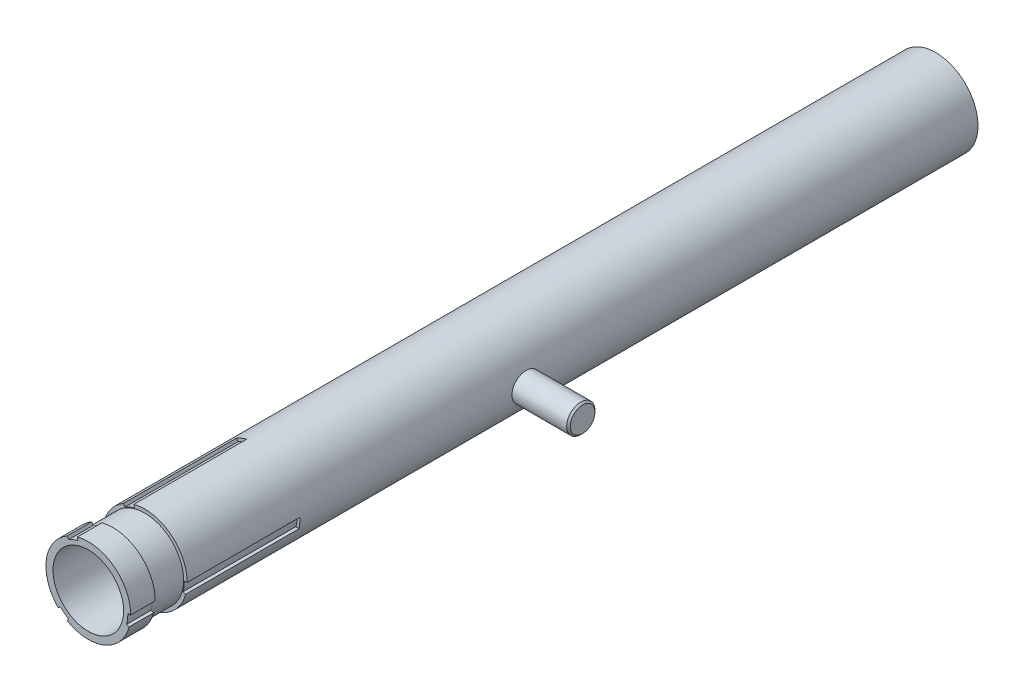
ISO-10303-21;
HEADER;
FILE_DESCRIPTION(('STEP AP214'),'2;1');
FILE_NAME('part.step','',(''),(''),'','','');
FILE_SCHEMA(('AUTOMOTIVE_DESIGN { 1 0 10303 214 1 1 1 1 }'));
ENDSEC;
DATA;
#1=APPLICATION_CONTEXT('core data for automotive mechanical design processes');
#2=APPLICATION_PROTOCOL_DEFINITION('international standard','automotive_design',2000,#1);
#3=PRODUCT_CONTEXT('',#1,'mechanical');
#4=PRODUCT('Part','Part','',(#3));
#5=PRODUCT_RELATED_PRODUCT_CATEGORY('part','',(#4));
#6=PRODUCT_DEFINITION_FORMATION('','',#4);
#7=PRODUCT_DEFINITION_CONTEXT('part definition',#1,'design');
#8=PRODUCT_DEFINITION('design','',#6,#7);
#9=PRODUCT_DEFINITION_SHAPE('','',#8);
#10=(LENGTH_UNIT() NAMED_UNIT(*) SI_UNIT(.MILLI.,.METRE.));
#11=(NAMED_UNIT(*) PLANE_ANGLE_UNIT() SI_UNIT($,.RADIAN.));
#12=(NAMED_UNIT(*) SI_UNIT($,.STERADIAN.) SOLID_ANGLE_UNIT());
#13=UNCERTAINTY_MEASURE_WITH_UNIT(LENGTH_MEASURE(1.E-05),#10,'distance_accuracy_value','');
#14=(GEOMETRIC_REPRESENTATION_CONTEXT(3) GLOBAL_UNCERTAINTY_ASSIGNED_CONTEXT((#13)) GLOBAL_UNIT_ASSIGNED_CONTEXT((#10,
#11,#12)) REPRESENTATION_CONTEXT('',''));
#15=CARTESIAN_POINT('',(0.,0.,0.));
#16=DIRECTION('',(0.,0.,1.));
#17=DIRECTION('',(1.,0.,0.));
#18=AXIS2_PLACEMENT_3D('',#15,#16,#17);
#19=CARTESIAN_POINT('',(323.85,0.,279.4));
#20=DIRECTION('',(-1.,0.,0.));
#21=DIRECTION('',(0.,0.,1.));
#22=AXIS2_PLACEMENT_3D('',#19,#20,#21);
#23=CYLINDRICAL_SURFACE('',#22,6.34999999999994);
#24=CARTESIAN_POINT('',(43.6562500000002,0.,279.4));
#25=DIRECTION('',(1.,0.,0.));
#26=DIRECTION('',(0.,0.,-1.));
#27=AXIS2_PLACEMENT_3D('',#24,#25,#26);
#28=CIRCLE('',#27,6.34999999999994);
#29=CARTESIAN_POINT('',(43.6562500000002,0.,285.75));
#30=VERTEX_POINT('',#29);
#31=EDGE_CURVE('E11',#30,#30,#28,.F.);
#32=CARTESIAN_POINT('',(19.05,0.,279.4));
#33=DIRECTION('',(1.,0.,0.));
#34=DIRECTION('',(0.,0.,-1.));
#35=AXIS2_PLACEMENT_3D('',#32,#33,#34);
#36=CIRCLE('',#35,6.34999999999994);
#37=CARTESIAN_POINT('',(19.05,0.,285.75));
#38=VERTEX_POINT('',#37);
#39=EDGE_CURVE('E60',#38,#38,#36,.T.);
#40=CARTESIAN_POINT('',(43.6562500000002,0.,285.75));
#41=CARTESIAN_POINT('',(43.3999348958335,0.,285.75));
#42=CARTESIAN_POINT('',(43.1436197916668,0.,285.75));
#43=CARTESIAN_POINT('',(42.6309895833335,0.,285.75));
#44=CARTESIAN_POINT('',(42.3746744791669,0.,285.75));
#45=CARTESIAN_POINT('',(41.8620442708335,0.,285.75));
#46=CARTESIAN_POINT('',(41.6057291666668,0.,285.75));
#47=CARTESIAN_POINT('',(41.0930989583335,0.,285.75));
#48=CARTESIAN_POINT('',(40.8367838541668,0.,285.75));
#49=CARTESIAN_POINT('',(40.3241536458335,0.,285.75));
#50=CARTESIAN_POINT('',(40.0678385416668,0.,285.75));
#51=CARTESIAN_POINT('',(39.5552083333335,0.,285.75));
#52=CARTESIAN_POINT('',(39.2988932291668,0.,285.75));
#53=CARTESIAN_POINT('',(38.7862630208335,0.,285.75));
#54=CARTESIAN_POINT('',(38.5299479166668,0.,285.75));
#55=CARTESIAN_POINT('',(38.0173177083335,0.,285.75));
#56=CARTESIAN_POINT('',(37.7610026041668,0.,285.75));
#57=CARTESIAN_POINT('',(37.2483723958335,0.,285.75));
#58=CARTESIAN_POINT('',(36.9920572916668,0.,285.75));
#59=CARTESIAN_POINT('',(36.4794270833335,0.,285.75));
#60=CARTESIAN_POINT('',(36.2231119791668,0.,285.75));
#61=CARTESIAN_POINT('',(35.7104817708335,0.,285.75));
#62=CARTESIAN_POINT('',(35.4541666666668,0.,285.75));
#63=CARTESIAN_POINT('',(34.9415364583334,0.,285.75));
#64=CARTESIAN_POINT('',(34.6852213541668,0.,285.75));
#65=CARTESIAN_POINT('',(34.1725911458335,0.,285.75));
#66=CARTESIAN_POINT('',(33.9162760416668,0.,285.75));
#67=CARTESIAN_POINT('',(33.4036458333334,0.,285.75));
#68=CARTESIAN_POINT('',(33.1473307291668,0.,285.75));
#69=CARTESIAN_POINT('',(32.6347005208334,0.,285.75));
#70=CARTESIAN_POINT('',(32.3783854166667,0.,285.75));
#71=CARTESIAN_POINT('',(31.8657552083334,0.,285.75));
#72=CARTESIAN_POINT('',(31.6094401041668,0.,285.75));
#73=CARTESIAN_POINT('',(31.0968098958334,0.,285.75));
#74=CARTESIAN_POINT('',(30.8404947916668,0.,285.75));
#75=CARTESIAN_POINT('',(30.3278645833334,0.,285.75));
#76=CARTESIAN_POINT('',(30.0715494791668,0.,285.75));
#77=CARTESIAN_POINT('',(29.5589192708334,0.,285.75));
#78=CARTESIAN_POINT('',(29.3026041666667,0.,285.75));
#79=CARTESIAN_POINT('',(28.7899739583334,0.,285.75));
#80=CARTESIAN_POINT('',(28.5336588541667,0.,285.75));
#81=CARTESIAN_POINT('',(28.0210286458334,0.,285.75));
#82=CARTESIAN_POINT('',(27.7647135416667,0.,285.75));
#83=CARTESIAN_POINT('',(27.2520833333334,0.,285.75));
#84=CARTESIAN_POINT('',(26.9957682291667,0.,285.75));
#85=CARTESIAN_POINT('',(26.4831380208334,0.,285.75));
#86=CARTESIAN_POINT('',(26.2268229166667,0.,285.75));
#87=CARTESIAN_POINT('',(25.7141927083334,0.,285.75));
#88=CARTESIAN_POINT('',(25.4578776041667,0.,285.75));
#89=CARTESIAN_POINT('',(24.9452473958334,0.,285.75));
#90=CARTESIAN_POINT('',(24.6889322916667,0.,285.75));
#91=CARTESIAN_POINT('',(24.1763020833334,0.,285.75));
#92=CARTESIAN_POINT('',(23.9199869791667,0.,285.75));
#93=CARTESIAN_POINT('',(23.4073567708334,0.,285.75));
#94=CARTESIAN_POINT('',(23.1510416666667,0.,285.75));
#95=CARTESIAN_POINT('',(22.6384114583334,0.,285.75));
#96=CARTESIAN_POINT('',(22.3820963541667,0.,285.75));
#97=CARTESIAN_POINT('',(21.8694661458334,0.,285.75));
#98=CARTESIAN_POINT('',(21.6131510416667,0.,285.75));
#99=CARTESIAN_POINT('',(21.1005208333334,0.,285.75));
#100=CARTESIAN_POINT('',(20.8442057291667,0.,285.75));
#101=CARTESIAN_POINT('',(20.3315755208333,0.,285.75));
#102=CARTESIAN_POINT('',(20.0752604166667,0.,285.75));
#103=CARTESIAN_POINT('',(19.5626302083333,0.,285.75));
#104=CARTESIAN_POINT('',(19.3063151041667,0.,285.75));
#105=CARTESIAN_POINT('',(19.05,0.,285.75));
#106=B_SPLINE_CURVE_WITH_KNOTS('',3,(#40,#41,#42,#43,#44,#45,#46,#47,#48,#49,#50,#51,#52,#53,
#54,#55,#56,#57,#58,#59,#60,#61,#62,#63,#64,#65,#66,#67,#68,#69,#70,#71,#72,#73,#74,#75,#76,#77,
#78,#79,#80,#81,#82,#83,#84,#85,#86,#87,#88,#89,#90,#91,#92,#93,#94,#95,#96,#97,#98,#99,#100,
#101,#102,#103,#104,#105),.UNSPECIFIED.,.F.,.F.,(4,2,2,2,2,2,2,2,2,2,2,2,2,2,2,2,2,2,2,2,2,2,2,
2,2,2,2,2,2,2,2,2,4),(0.,0.768945312499991,1.53789062499998,2.30683593750003,3.07578125000002,
3.84472656250001,4.61367187500006,5.38261718750005,6.15156250000004,6.92050781250003,
7.68945312500002,8.45839843750007,9.22734375000006,9.99628906250005,10.7652343750001,
11.5341796875001,12.3031250000001,13.0720703125001,13.8410156250001,14.6099609375001,
15.3789062500001,16.1478515625001,16.9167968750001,17.6857421875001,18.4546875000001,
19.2236328125001,19.9925781250001,20.7615234375002,21.5304687500001,22.2994140625001,
23.0683593750002,23.8373046875002,24.6062500000002),.UNSPECIFIED.);
#107=EDGE_CURVE('BSEAM48',#30,#38,#106,.T.);
#108=ORIENTED_EDGE('',*,*,#31,.T.);
#109=ORIENTED_EDGE('',*,*,#39,.T.);
#110=ORIENTED_EDGE('',*,*,#107,.T.);
#111=ORIENTED_EDGE('',*,*,#107,.F.);
#112=EDGE_LOOP('',(#108,#110,#109,#111));
#113=FACE_BOUND('',#112,.T.);
#114=ADVANCED_FACE('F48',(#113),#23,.T.);
#115=CARTESIAN_POINT('',(19.05,0.,279.4));
#116=DIRECTION('',(1.,0.,0.));
#117=DIRECTION('',(0.,0.,-1.));
#118=AXIS2_PLACEMENT_3D('',#115,#116,#117);
#119=PLANE('',#118);
#120=ORIENTED_EDGE('',*,*,#39,.F.);
#121=EDGE_LOOP('',(#120));
#122=FACE_BOUND('',#121,.T.);
#123=ADVANCED_FACE('F68',(#122),#119,.F.);
#124=CARTESIAN_POINT('',(44.45,0.,279.4));
#125=DIRECTION('',(1.,0.,0.));
#126=DIRECTION('',(0.,0.,-1.));
#127=AXIS2_PLACEMENT_3D('',#124,#125,#126);
#128=PLANE('',#127);
#129=CARTESIAN_POINT('',(44.45,0.,279.4));
#130=DIRECTION('',(1.,0.,0.));
#131=DIRECTION('',(0.,0.,-1.));
#132=AXIS2_PLACEMENT_3D('',#129,#130,#131);
#133=CIRCLE('',#132,5.5562500000001);
#134=CARTESIAN_POINT('',(44.45,0.,273.84375));
#135=VERTEX_POINT('',#134);
#136=EDGE_CURVE('E56',#135,#135,#133,.T.);
#137=ORIENTED_EDGE('',*,*,#136,.T.);
#138=EDGE_LOOP('',(#137));
#139=FACE_BOUND('',#138,.T.);
#140=ADVANCED_FACE('F70',(#139),#128,.T.);
#141=CARTESIAN_POINT('',(44.45,0.,279.4));
#142=DIRECTION('',(-1.,0.,0.));
#143=DIRECTION('',(0.,0.,1.));
#144=AXIS2_PLACEMENT_3D('',#141,#142,#143);
#145=CONICAL_SURFACE('',#144,5.5562500000001,0.785398163397431);
#146=ORIENTED_EDGE('',*,*,#31,.F.);
#147=EDGE_LOOP('',(#146));
#148=FACE_BOUND('',#147,.T.);
#149=ORIENTED_EDGE('',*,*,#136,.F.);
#150=EDGE_LOOP('',(#149));
#151=FACE_BOUND('',#150,.T.);
#152=ADVANCED_FACE('F51',(#148,#151),#145,.T.);
#153=CLOSED_SHELL('',(#114,#123,#140,#152));
#154=MANIFOLD_SOLID_BREP('B2',#153);
#155=CARTESIAN_POINT('',(0.,0.,914.4));
#156=DIRECTION('',(0.,0.,-1.));
#157=DIRECTION('',(-1.,0.,0.));
#158=AXIS2_PLACEMENT_3D('',#155,#156,#157);
#159=CYLINDRICAL_SURFACE('',#158,19.05);
#160=CARTESIAN_POINT('',(0.,0.,76.2));
#161=DIRECTION('',(0.,0.,1.));
#162=DIRECTION('',(1.,0.,0.));
#163=AXIS2_PLACEMENT_3D('',#160,#161,#162);
#164=CIRCLE('',#163,19.05);
#165=CARTESIAN_POINT('',(19.05,0.,76.2));
#166=VERTEX_POINT('',#165);
#167=EDGE_CURVE('E312',#166,#166,#164,.T.);
#168=ORIENTED_EDGE('',*,*,#167,.T.);
#169=EDGE_LOOP('',(#168));
#170=FACE_BOUND('',#169,.T.);
#171=CARTESIAN_POINT('',(-2.11636289388405E-13,0.,431.8));
#172=DIRECTION('',(0.,0.,1.));
#173=DIRECTION('',(1.,0.,0.));
#174=AXIS2_PLACEMENT_3D('',#171,#172,#173);
#175=CIRCLE('',#174,19.0499999999999);
#176=CARTESIAN_POINT('',(19.0499999999997,0.,431.8));
#177=VERTEX_POINT('',#176);
#178=CARTESIAN_POINT('',(-4.93050280920302,18.4008869908067,431.8));
#179=VERTEX_POINT('',#178);
#180=EDGE_CURVE('E321',#177,#179,#175,.T.);
#181=ORIENTED_EDGE('',*,*,#180,.F.);
#182=DIRECTION('',(0.,0.,1.));
#183=VECTOR('',#182,1.);
#184=CARTESIAN_POINT('',(19.05,0.,381.));
#185=LINE('',#184,#183);
#186=CARTESIAN_POINT('',(19.05,0.,381.));
#187=VERTEX_POINT('',#186);
#188=EDGE_CURVE('E329',#187,#177,#185,.T.);
#189=ORIENTED_EDGE('',*,*,#188,.F.);
#190=CARTESIAN_POINT('',(0.,0.,381.));
#191=DIRECTION('',(0.,0.,1.));
#192=DIRECTION('',(1.,0.,0.));
#193=AXIS2_PLACEMENT_3D('',#190,#191,#192);
#194=CIRCLE('',#193,19.05);
#195=CARTESIAN_POINT('',(18.4008869908068,-4.93050280920302,381.));
#196=VERTEX_POINT('',#195);
#197=EDGE_CURVE('E421',#196,#187,#194,.T.);
#198=ORIENTED_EDGE('',*,*,#197,.F.);
#199=DIRECTION('',(0.,0.,1.));
#200=VECTOR('',#199,1.);
#201=CARTESIAN_POINT('',(18.4008869908068,-4.93050280920302,381.));
#202=LINE('',#201,#200);
#203=CARTESIAN_POINT('',(18.4008869908065,-4.93050280920294,431.8));
#204=VERTEX_POINT('',#203);
#205=EDGE_CURVE('E422',#196,#204,#202,.T.);
#206=ORIENTED_EDGE('',*,*,#205,.T.);
#207=CARTESIAN_POINT('',(-9.52500000000001,-16.4977839420936,431.8));
#208=VERTEX_POINT('',#207);
#209=EDGE_CURVE('E333',#208,#204,#175,.T.);
#210=ORIENTED_EDGE('',*,*,#209,.F.);
#211=DIRECTION('',(0.,0.,1.));
#212=VECTOR('',#211,1.);
#213=CARTESIAN_POINT('',(-9.525,-16.4977839420936,381.));
#214=LINE('',#213,#212);
#215=CARTESIAN_POINT('',(-9.525,-16.4977839420936,381.));
#216=VERTEX_POINT('',#215);
#217=EDGE_CURVE('E379',#216,#208,#214,.T.);
#218=ORIENTED_EDGE('',*,*,#217,.F.);
#219=CARTESIAN_POINT('',(0.,0.,381.));
#220=DIRECTION('',(0.,0.,1.));
#221=DIRECTION('',(1.,0.,0.));
#222=AXIS2_PLACEMENT_3D('',#219,#220,#221);
#223=CIRCLE('',#222,19.05);
#224=CARTESIAN_POINT('',(-13.4703841816037,-13.4703841816037,381.));
#225=VERTEX_POINT('',#224);
#226=EDGE_CURVE('E345',#225,#216,#223,.T.);
#227=ORIENTED_EDGE('',*,*,#226,.F.);
#228=DIRECTION('',(0.,0.,1.));
#229=VECTOR('',#228,1.);
#230=CARTESIAN_POINT('',(-13.4703841816037,-13.4703841816037,381.));
#231=LINE('',#230,#229);
#232=CARTESIAN_POINT('',(-13.4703841816038,-13.4703841816038,431.8));
#233=VERTEX_POINT('',#232);
#234=EDGE_CURVE('E366',#225,#233,#231,.T.);
#235=ORIENTED_EDGE('',*,*,#234,.T.);
#236=CARTESIAN_POINT('',(-9.52500000000001,16.4977839420936,431.8));
#237=VERTEX_POINT('',#236);
#238=EDGE_CURVE('E331',#237,#233,#175,.T.);
#239=ORIENTED_EDGE('',*,*,#238,.F.);
#240=DIRECTION('',(0.,0.,1.));
#241=VECTOR('',#240,1.);
#242=CARTESIAN_POINT('',(-9.52500000000001,16.4977839420936,381.));
#243=LINE('',#242,#241);
#244=CARTESIAN_POINT('',(-9.52500000000001,16.4977839420936,381.));
#245=VERTEX_POINT('',#244);
#246=EDGE_CURVE('E303',#245,#237,#243,.T.);
#247=ORIENTED_EDGE('',*,*,#246,.F.);
#248=CARTESIAN_POINT('',(0.,0.,381.));
#249=DIRECTION('',(0.,0.,1.));
#250=DIRECTION('',(1.,0.,0.));
#251=AXIS2_PLACEMENT_3D('',#248,#249,#250);
#252=CIRCLE('',#251,19.05);
#253=CARTESIAN_POINT('',(-4.93050280920304,18.4008869908067,381.));
#254=VERTEX_POINT('',#253);
#255=EDGE_CURVE('E382',#254,#245,#252,.T.);
#256=ORIENTED_EDGE('',*,*,#255,.F.);
#257=DIRECTION('',(0.,0.,1.));
#258=VECTOR('',#257,1.);
#259=CARTESIAN_POINT('',(-4.93050280920304,18.4008869908067,381.));
#260=LINE('',#259,#258);
#261=EDGE_CURVE('E288',#254,#179,#260,.T.);
#262=ORIENTED_EDGE('',*,*,#261,.T.);
#263=EDGE_LOOP('',(#181,#189,#198,#206,#210,#218,#227,#235,#239,#247,#256,#262));
#264=FACE_BOUND('',#263,.T.);
#265=ADVANCED_FACE('F107',(#170,#264),#159,.T.);
#266=CARTESIAN_POINT('',(19.05,0.,446.151));
#267=VERTEX_POINT('',#266);
#268=CARTESIAN_POINT('',(19.05,0.,457.2));
#269=VERTEX_POINT('',#268);
#270=EDGE_CURVE('E280',#267,#269,#185,.T.);
#271=ORIENTED_EDGE('',*,*,#270,.F.);
#272=CARTESIAN_POINT('',(-2.11636289388405E-13,0.,446.151));
#273=DIRECTION('',(0.,0.,1.));
#274=DIRECTION('',(1.,0.,0.));
#275=AXIS2_PLACEMENT_3D('',#272,#273,#274);
#276=CIRCLE('',#275,19.0499999999999);
#277=CARTESIAN_POINT('',(-4.93050280920302,18.4008869908067,446.151));
#278=VERTEX_POINT('',#277);
#279=EDGE_CURVE('E122',#267,#278,#276,.T.);
#280=ORIENTED_EDGE('',*,*,#279,.T.);
#281=CARTESIAN_POINT('',(-4.93050280920304,18.4008869908067,457.2));
#282=VERTEX_POINT('',#281);
#283=EDGE_CURVE('E278',#278,#282,#260,.T.);
#284=ORIENTED_EDGE('',*,*,#283,.T.);
#285=CARTESIAN_POINT('',(0.,0.,457.2));
#286=DIRECTION('',(0.,0.,1.));
#287=DIRECTION('',(1.,0.,0.));
#288=AXIS2_PLACEMENT_3D('',#285,#286,#287);
#289=CIRCLE('',#288,19.05);
#290=EDGE_CURVE('E307',#269,#282,#289,.T.);
#291=ORIENTED_EDGE('',*,*,#290,.F.);
#292=EDGE_LOOP('',(#271,#280,#284,#291));
#293=FACE_BOUND('',#292,.T.);
#294=ADVANCED_FACE('F276',(#293),#159,.T.);
#295=CARTESIAN_POINT('',(-9.52500000000001,16.4977839420936,446.151));
#296=VERTEX_POINT('',#295);
#297=CARTESIAN_POINT('',(-9.52500000000001,16.4977839420936,457.2));
#298=VERTEX_POINT('',#297);
#299=EDGE_CURVE('E306',#296,#298,#243,.T.);
#300=ORIENTED_EDGE('',*,*,#299,.F.);
#301=CARTESIAN_POINT('',(-13.4703841816038,-13.4703841816038,446.151));
#302=VERTEX_POINT('',#301);
#303=EDGE_CURVE('E281',#296,#302,#276,.T.);
#304=ORIENTED_EDGE('',*,*,#303,.T.);
#305=CARTESIAN_POINT('',(-13.4703841816037,-13.4703841816037,457.2));
#306=VERTEX_POINT('',#305);
#307=EDGE_CURVE('E370',#302,#306,#231,.T.);
#308=ORIENTED_EDGE('',*,*,#307,.T.);
#309=EDGE_CURVE('E310',#298,#306,#289,.T.);
#310=ORIENTED_EDGE('',*,*,#309,.F.);
#311=EDGE_LOOP('',(#300,#304,#308,#310));
#312=FACE_BOUND('',#311,.T.);
#313=ADVANCED_FACE('F525',(#312),#159,.T.);
#314=CARTESIAN_POINT('',(-4.93050280920304,18.4008869908067,381.));
#315=DIRECTION('',(0.965925826289068,0.258819045102521,0.));
#316=DIRECTION('',(-0.258819045102521,0.965925826289068,0.));
#317=AXIS2_PLACEMENT_3D('',#314,#315,#316);
#318=PLANE('',#317);
#319=DIRECTION('',(0.258819045102521,-0.965925826289068,0.));
#320=VECTOR('',#319,1.);
#321=CARTESIAN_POINT('',(-4.93050280920304,18.4008869908068,431.8));
#322=LINE('',#321,#320);
#323=CARTESIAN_POINT('',(-4.60180262192283,17.1741611914196,431.8));
#324=VERTEX_POINT('',#323);
#325=EDGE_CURVE('E463',#179,#324,#322,.T.);
#326=ORIENTED_EDGE('',*,*,#325,.F.);
#327=ORIENTED_EDGE('',*,*,#261,.F.);
#328=DIRECTION('',(-0.258819045102521,0.965925826289068,0.));
#329=VECTOR('',#328,1.);
#330=CARTESIAN_POINT('',(-4.93050280920304,18.4008869908067,381.));
#331=LINE('',#330,#329);
#332=CARTESIAN_POINT('',(-4.60180262192283,17.1741611914196,381.));
#333=VERTEX_POINT('',#332);
#334=EDGE_CURVE('E391',#333,#254,#331,.T.);
#335=ORIENTED_EDGE('',*,*,#334,.F.);
#336=DIRECTION('',(0.,0.,1.));
#337=VECTOR('',#336,1.);
#338=CARTESIAN_POINT('',(-4.60180262192283,17.1741611914196,381.));
#339=LINE('',#338,#337);
#340=EDGE_CURVE('E289',#333,#324,#339,.T.);
#341=ORIENTED_EDGE('',*,*,#340,.T.);
#342=EDGE_LOOP('',(#326,#327,#335,#341));
#343=FACE_BOUND('',#342,.T.);
#344=ADVANCED_FACE('F540',(#343),#318,.F.);
#345=CARTESIAN_POINT('',(0.,0.,381.));
#346=DIRECTION('',(0.,0.,1.));
#347=DIRECTION('',(1.,0.,0.));
#348=AXIS2_PLACEMENT_3D('',#345,#346,#347);
#349=CYLINDRICAL_SURFACE('',#348,17.78);
#350=CARTESIAN_POINT('',(0.,0.,431.8));
#351=DIRECTION('',(0.,0.,1.));
#352=DIRECTION('',(1.,0.,0.));
#353=AXIS2_PLACEMENT_3D('',#350,#351,#352);
#354=CIRCLE('',#353,17.78);
#355=CARTESIAN_POINT('',(-8.89000000000001,15.3979316792873,431.8));
#356=VERTEX_POINT('',#355);
#357=EDGE_CURVE('E465',#324,#356,#354,.T.);
#358=ORIENTED_EDGE('',*,*,#357,.F.);
#359=ORIENTED_EDGE('',*,*,#340,.F.);
#360=CARTESIAN_POINT('',(0.,0.,381.));
#361=DIRECTION('',(0.,0.,-1.));
#362=DIRECTION('',(1.,0.,0.));
#363=AXIS2_PLACEMENT_3D('',#360,#361,#362);
#364=CIRCLE('',#363,17.78);
#365=CARTESIAN_POINT('',(-8.89000000000001,15.3979316792873,381.));
#366=VERTEX_POINT('',#365);
#367=EDGE_CURVE('E388',#366,#333,#364,.T.);
#368=ORIENTED_EDGE('',*,*,#367,.F.);
#369=DIRECTION('',(0.,0.,1.));
#370=VECTOR('',#369,1.);
#371=CARTESIAN_POINT('',(-8.89000000000001,15.3979316792873,381.));
#372=LINE('',#371,#370);
#373=EDGE_CURVE('E299',#366,#356,#372,.T.);
#374=ORIENTED_EDGE('',*,*,#373,.T.);
#375=EDGE_LOOP('',(#358,#359,#368,#374));
#376=FACE_BOUND('',#375,.T.);
#377=ADVANCED_FACE('F545',(#376),#349,.T.);
#378=CARTESIAN_POINT('',(-9.52500000000001,16.4977839420936,381.));
#379=DIRECTION('',(-0.866025403784438,-0.500000000000001,0.));
#380=DIRECTION('',(0.500000000000001,-0.866025403784438,0.));
#381=AXIS2_PLACEMENT_3D('',#378,#379,#380);
#382=PLANE('',#381);
#383=DIRECTION('',(-0.500000000000001,0.866025403784438,0.));
#384=VECTOR('',#383,1.);
#385=CARTESIAN_POINT('',(-9.52500000000002,16.4977839420936,431.8));
#386=LINE('',#385,#384);
#387=EDGE_CURVE('E467',#356,#237,#386,.T.);
#388=ORIENTED_EDGE('',*,*,#387,.F.);
#389=ORIENTED_EDGE('',*,*,#373,.F.);
#390=DIRECTION('',(0.500000000000001,-0.866025403784438,0.));
#391=VECTOR('',#390,1.);
#392=CARTESIAN_POINT('',(-9.52500000000001,16.4977839420936,381.));
#393=LINE('',#392,#391);
#394=EDGE_CURVE('E385',#245,#366,#393,.T.);
#395=ORIENTED_EDGE('',*,*,#394,.F.);
#396=ORIENTED_EDGE('',*,*,#246,.T.);
#397=EDGE_LOOP('',(#388,#389,#395,#396));
#398=FACE_BOUND('',#397,.T.);
#399=ADVANCED_FACE('F652',(#398),#382,.F.);
#400=CARTESIAN_POINT('',(-13.4703841816037,-13.4703841816037,381.));
#401=DIRECTION('',(-0.707106781186548,0.707106781186548,0.));
#402=DIRECTION('',(-0.707106781186548,-0.707106781186548,0.));
#403=AXIS2_PLACEMENT_3D('',#400,#401,#402);
#404=PLANE('',#403);
#405=DIRECTION('',(0.707106781186548,0.707106781186548,0.));
#406=VECTOR('',#405,1.);
#407=CARTESIAN_POINT('',(-13.4703841816037,-13.4703841816038,431.8));
#408=LINE('',#407,#406);
#409=CARTESIAN_POINT('',(-12.5723585694968,-12.5723585694968,431.8));
#410=VERTEX_POINT('',#409);
#411=EDGE_CURVE('E469',#233,#410,#408,.T.);
#412=ORIENTED_EDGE('',*,*,#411,.F.);
#413=ORIENTED_EDGE('',*,*,#234,.F.);
#414=DIRECTION('',(-0.707106781186548,-0.707106781186548,0.));
#415=VECTOR('',#414,1.);
#416=CARTESIAN_POINT('',(-13.4703841816037,-13.4703841816037,381.));
#417=LINE('',#416,#415);
#418=CARTESIAN_POINT('',(-12.5723585694968,-12.5723585694968,381.));
#419=VERTEX_POINT('',#418);
#420=EDGE_CURVE('E355',#419,#225,#417,.T.);
#421=ORIENTED_EDGE('',*,*,#420,.F.);
#422=DIRECTION('',(0.,0.,1.));
#423=VECTOR('',#422,1.);
#424=CARTESIAN_POINT('',(-12.5723585694968,-12.5723585694968,381.));
#425=LINE('',#424,#423);
#426=EDGE_CURVE('E371',#419,#410,#425,.T.);
#427=ORIENTED_EDGE('',*,*,#426,.T.);
#428=EDGE_LOOP('',(#412,#413,#421,#427));
#429=FACE_BOUND('',#428,.T.);
#430=ADVANCED_FACE('F492',(#429),#404,.F.);
#431=CARTESIAN_POINT('',(0.,0.,381.));
#432=DIRECTION('',(0.,0.,1.));
#433=DIRECTION('',(1.,0.,0.));
#434=AXIS2_PLACEMENT_3D('',#431,#432,#433);
#435=CYLINDRICAL_SURFACE('',#434,17.78);
#436=CARTESIAN_POINT('',(0.,0.,431.8));
#437=DIRECTION('',(0.,0.,1.));
#438=DIRECTION('',(1.,0.,0.));
#439=AXIS2_PLACEMENT_3D('',#436,#437,#438);
#440=CIRCLE('',#439,17.78);
#441=CARTESIAN_POINT('',(-8.88999999999999,-15.3979316792873,431.8));
#442=VERTEX_POINT('',#441);
#443=EDGE_CURVE('E471',#410,#442,#440,.T.);
#444=ORIENTED_EDGE('',*,*,#443,.F.);
#445=ORIENTED_EDGE('',*,*,#426,.F.);
#446=CARTESIAN_POINT('',(0.,0.,381.));
#447=DIRECTION('',(0.,0.,-1.));
#448=DIRECTION('',(1.,0.,0.));
#449=AXIS2_PLACEMENT_3D('',#446,#447,#448);
#450=CIRCLE('',#449,17.78);
#451=CARTESIAN_POINT('',(-8.88999999999999,-15.3979316792873,381.));
#452=VERTEX_POINT('',#451);
#453=EDGE_CURVE('E352',#452,#419,#450,.T.);
#454=ORIENTED_EDGE('',*,*,#453,.F.);
#455=DIRECTION('',(0.,0.,1.));
#456=VECTOR('',#455,1.);
#457=CARTESIAN_POINT('',(-8.88999999999999,-15.3979316792873,381.));
#458=LINE('',#457,#456);
#459=EDGE_CURVE('E375',#452,#442,#458,.T.);
#460=ORIENTED_EDGE('',*,*,#459,.T.);
#461=EDGE_LOOP('',(#444,#445,#454,#460));
#462=FACE_BOUND('',#461,.T.);
#463=ADVANCED_FACE('F500',(#462),#435,.T.);
#464=CARTESIAN_POINT('',(-9.525,-16.4977839420936,381.));
#465=DIRECTION('',(0.866025403784439,-0.499999999999999,0.));
#466=DIRECTION('',(0.499999999999999,0.866025403784439,0.));
#467=AXIS2_PLACEMENT_3D('',#464,#465,#466);
#468=PLANE('',#467);
#469=DIRECTION('',(-0.499999999999999,-0.866025403784439,0.));
#470=VECTOR('',#469,1.);
#471=CARTESIAN_POINT('',(-9.52500000000001,-16.4977839420936,431.8));
#472=LINE('',#471,#470);
#473=EDGE_CURVE('E473',#442,#208,#472,.T.);
#474=ORIENTED_EDGE('',*,*,#473,.F.);
#475=ORIENTED_EDGE('',*,*,#459,.F.);
#476=DIRECTION('',(0.499999999999999,0.866025403784439,0.));
#477=VECTOR('',#476,1.);
#478=CARTESIAN_POINT('',(-9.525,-16.4977839420936,381.));
#479=LINE('',#478,#477);
#480=EDGE_CURVE('E348',#216,#452,#479,.T.);
#481=ORIENTED_EDGE('',*,*,#480,.F.);
#482=ORIENTED_EDGE('',*,*,#217,.T.);
#483=EDGE_LOOP('',(#474,#475,#481,#482));
#484=FACE_BOUND('',#483,.T.);
#485=ADVANCED_FACE('F503',(#484),#468,.F.);
#486=CARTESIAN_POINT('',(18.4008869908068,-4.93050280920302,381.));
#487=DIRECTION('',(-0.258819045102521,-0.965925826289068,0.));
#488=DIRECTION('',(0.965925826289068,-0.258819045102521,0.));
#489=AXIS2_PLACEMENT_3D('',#486,#487,#488);
#490=PLANE('',#489);
#491=DIRECTION('',(-0.965925826289068,0.258819045102521,0.));
#492=VECTOR('',#491,1.);
#493=CARTESIAN_POINT('',(18.4008869908067,-4.93050280920301,431.8));
#494=LINE('',#493,#492);
#495=CARTESIAN_POINT('',(17.1741611914196,-4.60180262192282,431.8));
#496=VERTEX_POINT('',#495);
#497=EDGE_CURVE('E475',#204,#496,#494,.T.);
#498=ORIENTED_EDGE('',*,*,#497,.F.);
#499=ORIENTED_EDGE('',*,*,#205,.F.);
#500=DIRECTION('',(0.965925826289068,-0.258819045102521,0.));
#501=VECTOR('',#500,1.);
#502=CARTESIAN_POINT('',(18.4008869908068,-4.93050280920302,381.));
#503=LINE('',#502,#501);
#504=CARTESIAN_POINT('',(17.1741611914196,-4.60180262192282,381.));
#505=VERTEX_POINT('',#504);
#506=EDGE_CURVE('E342',#505,#196,#503,.T.);
#507=ORIENTED_EDGE('',*,*,#506,.F.);
#508=DIRECTION('',(0.,0.,1.));
#509=VECTOR('',#508,1.);
#510=CARTESIAN_POINT('',(17.1741611914196,-4.60180262192282,381.));
#511=LINE('',#510,#509);
#512=EDGE_CURVE('E425',#505,#496,#511,.T.);
#513=ORIENTED_EDGE('',*,*,#512,.T.);
#514=EDGE_LOOP('',(#498,#499,#507,#513));
#515=FACE_BOUND('',#514,.T.);
#516=ADVANCED_FACE('F505',(#515),#490,.F.);
#517=CARTESIAN_POINT('',(0.,0.,381.));
#518=DIRECTION('',(0.,0.,1.));
#519=DIRECTION('',(1.,0.,0.));
#520=AXIS2_PLACEMENT_3D('',#517,#518,#519);
#521=CYLINDRICAL_SURFACE('',#520,17.78);
#522=CARTESIAN_POINT('',(0.,0.,431.8));
#523=DIRECTION('',(0.,0.,1.));
#524=DIRECTION('',(1.,0.,0.));
#525=AXIS2_PLACEMENT_3D('',#522,#523,#524);
#526=CIRCLE('',#525,17.78);
#527=CARTESIAN_POINT('',(17.78,0.,431.8));
#528=VERTEX_POINT('',#527);
#529=EDGE_CURVE('E129',#496,#528,#526,.T.);
#530=ORIENTED_EDGE('',*,*,#529,.F.);
#531=ORIENTED_EDGE('',*,*,#512,.F.);
#532=CARTESIAN_POINT('',(0.,0.,381.));
#533=DIRECTION('',(0.,0.,-1.));
#534=DIRECTION('',(1.,0.,0.));
#535=AXIS2_PLACEMENT_3D('',#532,#533,#534);
#536=CIRCLE('',#535,17.78);
#537=CARTESIAN_POINT('',(17.78,0.,381.));
#538=VERTEX_POINT('',#537);
#539=EDGE_CURVE('E438',#538,#505,#536,.T.);
#540=ORIENTED_EDGE('',*,*,#539,.F.);
#541=DIRECTION('',(0.,0.,1.));
#542=VECTOR('',#541,1.);
#543=CARTESIAN_POINT('',(17.78,0.,381.));
#544=LINE('',#543,#542);
#545=EDGE_CURVE('E340',#538,#528,#544,.T.);
#546=ORIENTED_EDGE('',*,*,#545,.T.);
#547=EDGE_LOOP('',(#530,#531,#540,#546));
#548=FACE_BOUND('',#547,.T.);
#549=ADVANCED_FACE('F436',(#548),#521,.T.);
#550=CARTESIAN_POINT('',(19.05,0.,381.));
#551=DIRECTION('',(0.,1.,0.));
#552=DIRECTION('',(-1.,0.,0.));
#553=AXIS2_PLACEMENT_3D('',#550,#551,#552);
#554=PLANE('',#553);
#555=DIRECTION('',(1.,0.,0.));
#556=VECTOR('',#555,1.);
#557=CARTESIAN_POINT('',(19.05,0.,431.8));
#558=LINE('',#557,#556);
#559=EDGE_CURVE('E115',#528,#177,#558,.T.);
#560=ORIENTED_EDGE('',*,*,#559,.F.);
#561=ORIENTED_EDGE('',*,*,#545,.F.);
#562=DIRECTION('',(-1.,0.,0.));
#563=VECTOR('',#562,1.);
#564=CARTESIAN_POINT('',(19.05,0.,381.));
#565=LINE('',#564,#563);
#566=EDGE_CURVE('E336',#187,#538,#565,.T.);
#567=ORIENTED_EDGE('',*,*,#566,.F.);
#568=ORIENTED_EDGE('',*,*,#188,.T.);
#569=EDGE_LOOP('',(#560,#561,#567,#568));
#570=FACE_BOUND('',#569,.T.);
#571=ADVANCED_FACE('F334',(#570),#554,.F.);
#572=CARTESIAN_POINT('',(-9.52500000000001,-16.4977839420936,446.151));
#573=VERTEX_POINT('',#572);
#574=CARTESIAN_POINT('',(-9.52499999999999,-16.4977839420936,457.2));
#575=VERTEX_POINT('',#574);
#576=EDGE_CURVE('E358',#573,#575,#214,.T.);
#577=ORIENTED_EDGE('',*,*,#576,.F.);
#578=CARTESIAN_POINT('',(18.4008869908065,-4.93050280920294,446.151));
#579=VERTEX_POINT('',#578);
#580=EDGE_CURVE('E283',#573,#579,#276,.T.);
#581=ORIENTED_EDGE('',*,*,#580,.T.);
#582=CARTESIAN_POINT('',(18.4008869908068,-4.93050280920302,457.2));
#583=VERTEX_POINT('',#582);
#584=EDGE_CURVE('E424',#579,#583,#202,.T.);
#585=ORIENTED_EDGE('',*,*,#584,.T.);
#586=EDGE_CURVE('E311',#575,#583,#289,.T.);
#587=ORIENTED_EDGE('',*,*,#586,.F.);
#588=EDGE_LOOP('',(#577,#581,#585,#587));
#589=FACE_BOUND('',#588,.T.);
#590=ADVANCED_FACE('F109',(#589),#159,.T.);
#591=CARTESIAN_POINT('',(0.,0.,914.4));
#592=DIRECTION('',(0.,0.,-1.));
#593=DIRECTION('',(-1.,0.,0.));
#594=AXIS2_PLACEMENT_3D('',#591,#592,#593);
#595=CYLINDRICAL_SURFACE('',#594,15.875);
#596=CARTESIAN_POINT('',(0.,0.,76.2));
#597=DIRECTION('',(0.,0.,1.));
#598=DIRECTION('',(1.,0.,0.));
#599=AXIS2_PLACEMENT_3D('',#596,#597,#598);
#600=CIRCLE('',#599,15.875);
#601=CARTESIAN_POINT('',(15.875,0.,76.2));
#602=VERTEX_POINT('',#601);
#603=EDGE_CURVE('E315',#602,#602,#600,.T.);
#604=ORIENTED_EDGE('',*,*,#603,.F.);
#605=EDGE_LOOP('',(#604));
#606=FACE_BOUND('',#605,.T.);
#607=CARTESIAN_POINT('',(0.,0.,457.2));
#608=DIRECTION('',(0.,0.,1.));
#609=DIRECTION('',(1.,0.,0.));
#610=AXIS2_PLACEMENT_3D('',#607,#608,#609);
#611=CIRCLE('',#610,15.875);
#612=CARTESIAN_POINT('',(15.875,0.,457.2));
#613=VERTEX_POINT('',#612);
#614=EDGE_CURVE('E309',#613,#613,#611,.T.);
#615=ORIENTED_EDGE('',*,*,#614,.T.);
#616=EDGE_LOOP('',(#615));
#617=FACE_BOUND('',#616,.T.);
#618=ADVANCED_FACE('F527',(#606,#617),#595,.F.);
#619=CARTESIAN_POINT('',(0.,0.,76.2));
#620=DIRECTION('',(0.,0.,1.));
#621=DIRECTION('',(1.,0.,0.));
#622=AXIS2_PLACEMENT_3D('',#619,#620,#621);
#623=PLANE('',#622);
#624=ORIENTED_EDGE('',*,*,#603,.T.);
#625=EDGE_LOOP('',(#624));
#626=FACE_BOUND('',#625,.T.);
#627=ORIENTED_EDGE('',*,*,#167,.F.);
#628=EDGE_LOOP('',(#627));
#629=FACE_BOUND('',#628,.T.);
#630=ADVANCED_FACE('F534',(#626,#629),#623,.F.);
#631=CARTESIAN_POINT('',(0.,0.,457.2));
#632=DIRECTION('',(0.,0.,1.));
#633=DIRECTION('',(1.,0.,0.));
#634=AXIS2_PLACEMENT_3D('',#631,#632,#633);
#635=PLANE('',#634);
#636=DIRECTION('',(0.965925826289068,-0.258819045102521,0.));
#637=VECTOR('',#636,1.);
#638=CARTESIAN_POINT('',(18.4008869908068,-4.93050280920302,457.2));
#639=LINE('',#638,#637);
#640=CARTESIAN_POINT('',(17.1741611914196,-4.60180262192282,457.2));
#641=VERTEX_POINT('',#640);
#642=EDGE_CURVE('E414',#641,#583,#639,.T.);
#643=ORIENTED_EDGE('',*,*,#642,.F.);
#644=CARTESIAN_POINT('',(0.,0.,457.2));
#645=DIRECTION('',(0.,0.,-1.));
#646=DIRECTION('',(1.,0.,0.));
#647=AXIS2_PLACEMENT_3D('',#644,#645,#646);
#648=CIRCLE('',#647,17.78);
#649=CARTESIAN_POINT('',(17.78,0.,457.2));
#650=VERTEX_POINT('',#649);
#651=EDGE_CURVE('E410',#650,#641,#648,.T.);
#652=ORIENTED_EDGE('',*,*,#651,.F.);
#653=DIRECTION('',(-1.,0.,0.));
#654=VECTOR('',#653,1.);
#655=CARTESIAN_POINT('',(19.05,0.,457.2));
#656=LINE('',#655,#654);
#657=EDGE_CURVE('E369',#269,#650,#656,.T.);
#658=ORIENTED_EDGE('',*,*,#657,.F.);
#659=ORIENTED_EDGE('',*,*,#290,.T.);
#660=DIRECTION('',(-0.258819045102521,0.965925826289068,0.));
#661=VECTOR('',#660,1.);
#662=CARTESIAN_POINT('',(-4.93050280920304,18.4008869908067,457.2));
#663=LINE('',#662,#661);
#664=CARTESIAN_POINT('',(-4.60180262192283,17.1741611914196,457.2));
#665=VERTEX_POINT('',#664);
#666=EDGE_CURVE('E286',#665,#282,#663,.T.);
#667=ORIENTED_EDGE('',*,*,#666,.F.);
#668=CARTESIAN_POINT('',(0.,0.,457.2));
#669=DIRECTION('',(0.,0.,-1.));
#670=DIRECTION('',(1.,0.,0.));
#671=AXIS2_PLACEMENT_3D('',#668,#669,#670);
#672=CIRCLE('',#671,17.78);
#673=CARTESIAN_POINT('',(-8.89000000000001,15.3979316792873,457.2));
#674=VERTEX_POINT('',#673);
#675=EDGE_CURVE('E395',#674,#665,#672,.T.);
#676=ORIENTED_EDGE('',*,*,#675,.F.);
#677=DIRECTION('',(0.500000000000001,-0.866025403784438,0.));
#678=VECTOR('',#677,1.);
#679=CARTESIAN_POINT('',(-9.52500000000001,16.4977839420936,457.2));
#680=LINE('',#679,#678);
#681=EDGE_CURVE('E272',#298,#674,#680,.T.);
#682=ORIENTED_EDGE('',*,*,#681,.F.);
#683=ORIENTED_EDGE('',*,*,#309,.T.);
#684=DIRECTION('',(-0.707106781186548,-0.707106781186548,0.));
#685=VECTOR('',#684,1.);
#686=CARTESIAN_POINT('',(-13.4703841816037,-13.4703841816037,457.2));
#687=LINE('',#686,#685);
#688=CARTESIAN_POINT('',(-12.5723585694968,-12.5723585694968,457.2));
#689=VERTEX_POINT('',#688);
#690=EDGE_CURVE('E349',#689,#306,#687,.T.);
#691=ORIENTED_EDGE('',*,*,#690,.F.);
#692=CARTESIAN_POINT('',(0.,0.,457.2));
#693=DIRECTION('',(0.,0.,-1.));
#694=DIRECTION('',(1.,0.,0.));
#695=AXIS2_PLACEMENT_3D('',#692,#693,#694);
#696=CIRCLE('',#695,17.78);
#697=CARTESIAN_POINT('',(-8.88999999999999,-15.3979316792873,457.2));
#698=VERTEX_POINT('',#697);
#699=EDGE_CURVE('E361',#698,#689,#696,.T.);
#700=ORIENTED_EDGE('',*,*,#699,.F.);
#701=DIRECTION('',(0.499999999999999,0.866025403784439,0.));
#702=VECTOR('',#701,1.);
#703=CARTESIAN_POINT('',(-9.525,-16.4977839420936,457.2));
#704=LINE('',#703,#702);
#705=EDGE_CURVE('E292',#575,#698,#704,.T.);
#706=ORIENTED_EDGE('',*,*,#705,.F.);
#707=ORIENTED_EDGE('',*,*,#586,.T.);
#708=EDGE_LOOP('',(#643,#652,#658,#659,#667,#676,#682,#683,#691,#700,#706,#707));
#709=FACE_BOUND('',#708,.T.);
#710=ORIENTED_EDGE('',*,*,#614,.F.);
#711=EDGE_LOOP('',(#710));
#712=FACE_BOUND('',#711,.T.);
#713=ADVANCED_FACE('F404',(#709,#712),#635,.T.);
#714=ORIENTED_EDGE('',*,*,#283,.F.);
#715=DIRECTION('',(0.258819045102521,-0.965925826289068,0.));
#716=VECTOR('',#715,1.);
#717=CARTESIAN_POINT('',(-4.93050280920304,18.4008869908068,446.151));
#718=LINE('',#717,#716);
#719=CARTESIAN_POINT('',(-4.60180262192283,17.1741611914196,446.151));
#720=VERTEX_POINT('',#719);
#721=EDGE_CURVE('E265',#278,#720,#718,.T.);
#722=ORIENTED_EDGE('',*,*,#721,.T.);
#723=EDGE_CURVE('E294',#720,#665,#339,.T.);
#724=ORIENTED_EDGE('',*,*,#723,.T.);
#725=ORIENTED_EDGE('',*,*,#666,.T.);
#726=EDGE_LOOP('',(#714,#722,#724,#725));
#727=FACE_BOUND('',#726,.T.);
#728=ADVANCED_FACE('F284',(#727),#318,.F.);
#729=ORIENTED_EDGE('',*,*,#723,.F.);
#730=CARTESIAN_POINT('',(0.,0.,446.151));
#731=DIRECTION('',(0.,0.,1.));
#732=DIRECTION('',(1.,0.,0.));
#733=AXIS2_PLACEMENT_3D('',#730,#731,#732);
#734=CIRCLE('',#733,17.78);
#735=CARTESIAN_POINT('',(-8.89000000000001,15.3979316792873,446.151));
#736=VERTEX_POINT('',#735);
#737=EDGE_CURVE('E268',#720,#736,#734,.T.);
#738=ORIENTED_EDGE('',*,*,#737,.T.);
#739=EDGE_CURVE('E302',#736,#674,#372,.T.);
#740=ORIENTED_EDGE('',*,*,#739,.T.);
#741=ORIENTED_EDGE('',*,*,#675,.T.);
#742=EDGE_LOOP('',(#729,#738,#740,#741));
#743=FACE_BOUND('',#742,.T.);
#744=ADVANCED_FACE('F399',(#743),#349,.T.);
#745=ORIENTED_EDGE('',*,*,#739,.F.);
#746=DIRECTION('',(-0.500000000000001,0.866025403784438,0.));
#747=VECTOR('',#746,1.);
#748=CARTESIAN_POINT('',(-9.52500000000002,16.4977839420936,446.151));
#749=LINE('',#748,#747);
#750=EDGE_CURVE('E446',#736,#296,#749,.T.);
#751=ORIENTED_EDGE('',*,*,#750,.T.);
#752=ORIENTED_EDGE('',*,*,#299,.T.);
#753=ORIENTED_EDGE('',*,*,#681,.T.);
#754=EDGE_LOOP('',(#745,#751,#752,#753));
#755=FACE_BOUND('',#754,.T.);
#756=ADVANCED_FACE('F554',(#755),#382,.F.);
#757=CARTESIAN_POINT('',(0.,0.,381.));
#758=DIRECTION('',(0.,0.,1.));
#759=DIRECTION('',(1.,0.,0.));
#760=AXIS2_PLACEMENT_3D('',#757,#758,#759);
#761=PLANE('',#760);
#762=ORIENTED_EDGE('',*,*,#255,.T.);
#763=ORIENTED_EDGE('',*,*,#394,.T.);
#764=ORIENTED_EDGE('',*,*,#367,.T.);
#765=ORIENTED_EDGE('',*,*,#334,.T.);
#766=EDGE_LOOP('',(#762,#763,#764,#765));
#767=FACE_BOUND('',#766,.T.);
#768=ADVANCED_FACE('F577',(#767),#761,.T.);
#769=ORIENTED_EDGE('',*,*,#307,.F.);
#770=DIRECTION('',(0.707106781186548,0.707106781186548,0.));
#771=VECTOR('',#770,1.);
#772=CARTESIAN_POINT('',(-13.4703841816038,-13.4703841816038,446.151));
#773=LINE('',#772,#771);
#774=CARTESIAN_POINT('',(-12.5723585694968,-12.5723585694968,446.151));
#775=VERTEX_POINT('',#774);
#776=EDGE_CURVE('E449',#302,#775,#773,.T.);
#777=ORIENTED_EDGE('',*,*,#776,.T.);
#778=EDGE_CURVE('E374',#775,#689,#425,.T.);
#779=ORIENTED_EDGE('',*,*,#778,.T.);
#780=ORIENTED_EDGE('',*,*,#690,.T.);
#781=EDGE_LOOP('',(#769,#777,#779,#780));
#782=FACE_BOUND('',#781,.T.);
#783=ADVANCED_FACE('F575',(#782),#404,.F.);
#784=ORIENTED_EDGE('',*,*,#778,.F.);
#785=CARTESIAN_POINT('',(0.,0.,446.151));
#786=DIRECTION('',(0.,0.,1.));
#787=DIRECTION('',(1.,0.,0.));
#788=AXIS2_PLACEMENT_3D('',#785,#786,#787);
#789=CIRCLE('',#788,17.78);
#790=CARTESIAN_POINT('',(-8.89,-15.3979316792873,446.151));
#791=VERTEX_POINT('',#790);
#792=EDGE_CURVE('E452',#775,#791,#789,.T.);
#793=ORIENTED_EDGE('',*,*,#792,.T.);
#794=EDGE_CURVE('E378',#791,#698,#458,.T.);
#795=ORIENTED_EDGE('',*,*,#794,.T.);
#796=ORIENTED_EDGE('',*,*,#699,.T.);
#797=EDGE_LOOP('',(#784,#793,#795,#796));
#798=FACE_BOUND('',#797,.T.);
#799=ADVANCED_FACE('F515',(#798),#435,.T.);
#800=ORIENTED_EDGE('',*,*,#794,.F.);
#801=DIRECTION('',(-0.499999999999999,-0.866025403784439,0.));
#802=VECTOR('',#801,1.);
#803=CARTESIAN_POINT('',(-9.52500000000001,-16.4977839420936,446.151));
#804=LINE('',#803,#802);
#805=EDGE_CURVE('E455',#791,#573,#804,.T.);
#806=ORIENTED_EDGE('',*,*,#805,.T.);
#807=ORIENTED_EDGE('',*,*,#576,.T.);
#808=ORIENTED_EDGE('',*,*,#705,.T.);
#809=EDGE_LOOP('',(#800,#806,#807,#808));
#810=FACE_BOUND('',#809,.T.);
#811=ADVANCED_FACE('F507',(#810),#468,.F.);
#812=CARTESIAN_POINT('',(0.,0.,381.));
#813=DIRECTION('',(0.,0.,1.));
#814=DIRECTION('',(1.,0.,0.));
#815=AXIS2_PLACEMENT_3D('',#812,#813,#814);
#816=PLANE('',#815);
#817=ORIENTED_EDGE('',*,*,#226,.T.);
#818=ORIENTED_EDGE('',*,*,#480,.T.);
#819=ORIENTED_EDGE('',*,*,#453,.T.);
#820=ORIENTED_EDGE('',*,*,#420,.T.);
#821=EDGE_LOOP('',(#817,#818,#819,#820));
#822=FACE_BOUND('',#821,.T.);
#823=ADVANCED_FACE('F497',(#822),#816,.T.);
#824=ORIENTED_EDGE('',*,*,#584,.F.);
#825=DIRECTION('',(-0.965925826289068,0.258819045102521,0.));
#826=VECTOR('',#825,1.);
#827=CARTESIAN_POINT('',(18.4008869908067,-4.930502809203,446.151));
#828=LINE('',#827,#826);
#829=CARTESIAN_POINT('',(17.1741611914196,-4.60180262192282,446.151));
#830=VERTEX_POINT('',#829);
#831=EDGE_CURVE('E458',#579,#830,#828,.T.);
#832=ORIENTED_EDGE('',*,*,#831,.T.);
#833=EDGE_CURVE('E427',#830,#641,#511,.T.);
#834=ORIENTED_EDGE('',*,*,#833,.T.);
#835=ORIENTED_EDGE('',*,*,#642,.T.);
#836=EDGE_LOOP('',(#824,#832,#834,#835));
#837=FACE_BOUND('',#836,.T.);
#838=ADVANCED_FACE('F513',(#837),#490,.F.);
#839=ORIENTED_EDGE('',*,*,#833,.F.);
#840=CARTESIAN_POINT('',(0.,0.,446.151));
#841=DIRECTION('',(0.,0.,1.));
#842=DIRECTION('',(1.,0.,0.));
#843=AXIS2_PLACEMENT_3D('',#840,#841,#842);
#844=CIRCLE('',#843,17.78);
#845=CARTESIAN_POINT('',(17.78,0.,446.151));
#846=VERTEX_POINT('',#845);
#847=EDGE_CURVE('E460',#830,#846,#844,.T.);
#848=ORIENTED_EDGE('',*,*,#847,.T.);
#849=EDGE_CURVE('E338',#846,#650,#544,.T.);
#850=ORIENTED_EDGE('',*,*,#849,.T.);
#851=ORIENTED_EDGE('',*,*,#651,.T.);
#852=EDGE_LOOP('',(#839,#848,#850,#851));
#853=FACE_BOUND('',#852,.T.);
#854=ADVANCED_FACE('F563',(#853),#521,.T.);
#855=ORIENTED_EDGE('',*,*,#849,.F.);
#856=DIRECTION('',(1.,0.,0.));
#857=VECTOR('',#856,1.);
#858=CARTESIAN_POINT('',(19.0499999999999,0.,446.151));
#859=LINE('',#858,#857);
#860=EDGE_CURVE('E46',#846,#267,#859,.T.);
#861=ORIENTED_EDGE('',*,*,#860,.T.);
#862=ORIENTED_EDGE('',*,*,#270,.T.);
#863=ORIENTED_EDGE('',*,*,#657,.T.);
#864=EDGE_LOOP('',(#855,#861,#862,#863));
#865=FACE_BOUND('',#864,.T.);
#866=ADVANCED_FACE('F537',(#865),#554,.F.);
#867=CARTESIAN_POINT('',(0.,0.,381.));
#868=DIRECTION('',(0.,0.,1.));
#869=DIRECTION('',(1.,0.,0.));
#870=AXIS2_PLACEMENT_3D('',#867,#868,#869);
#871=PLANE('',#870);
#872=ORIENTED_EDGE('',*,*,#197,.T.);
#873=ORIENTED_EDGE('',*,*,#566,.T.);
#874=ORIENTED_EDGE('',*,*,#539,.T.);
#875=ORIENTED_EDGE('',*,*,#506,.T.);
#876=EDGE_LOOP('',(#872,#873,#874,#875));
#877=FACE_BOUND('',#876,.T.);
#878=ADVANCED_FACE('F441',(#877),#871,.T.);
#879=CARTESIAN_POINT('',(-2.11636289388405E-13,0.,446.151));
#880=DIRECTION('',(0.,0.,1.));
#881=DIRECTION('',(1.,0.,0.));
#882=AXIS2_PLACEMENT_3D('',#879,#880,#881);
#883=PLANE('',#882);
#884=CARTESIAN_POINT('',(-2.11636289388405E-13,0.,446.151));
#885=DIRECTION('',(0.,0.,1.));
#886=DIRECTION('',(1.,0.,0.));
#887=AXIS2_PLACEMENT_3D('',#884,#885,#886);
#888=CIRCLE('',#887,17.4625);
#889=CARTESIAN_POINT('',(-17.4625000000002,0.,446.151));
#890=VERTEX_POINT('',#889);
#891=EDGE_CURVE('E481',#890,#890,#888,.T.);
#892=ORIENTED_EDGE('',*,*,#891,.T.);
#893=EDGE_LOOP('',(#892));
#894=FACE_BOUND('',#893,.T.);
#895=ORIENTED_EDGE('',*,*,#279,.F.);
#896=ORIENTED_EDGE('',*,*,#860,.F.);
#897=ORIENTED_EDGE('',*,*,#847,.F.);
#898=ORIENTED_EDGE('',*,*,#831,.F.);
#899=ORIENTED_EDGE('',*,*,#580,.F.);
#900=ORIENTED_EDGE('',*,*,#805,.F.);
#901=ORIENTED_EDGE('',*,*,#792,.F.);
#902=ORIENTED_EDGE('',*,*,#776,.F.);
#903=ORIENTED_EDGE('',*,*,#303,.F.);
#904=ORIENTED_EDGE('',*,*,#750,.F.);
#905=ORIENTED_EDGE('',*,*,#737,.F.);
#906=ORIENTED_EDGE('',*,*,#721,.F.);
#907=EDGE_LOOP('',(#895,#896,#897,#898,#899,#900,#901,#902,#903,#904,#905,#906));
#908=FACE_BOUND('',#907,.T.);
#909=ADVANCED_FACE('F266',(#894,#908),#883,.F.);
#910=CARTESIAN_POINT('',(-2.11636289388405E-13,0.,431.8));
#911=DIRECTION('',(0.,0.,1.));
#912=DIRECTION('',(1.,0.,0.));
#913=AXIS2_PLACEMENT_3D('',#910,#911,#912);
#914=PLANE('',#913);
#915=CARTESIAN_POINT('',(-2.11636289388405E-13,0.,431.8));
#916=DIRECTION('',(0.,0.,1.));
#917=DIRECTION('',(1.,0.,0.));
#918=AXIS2_PLACEMENT_3D('',#915,#916,#917);
#919=CIRCLE('',#918,17.4625);
#920=CARTESIAN_POINT('',(-17.4625000000002,0.,431.8));
#921=VERTEX_POINT('',#920);
#922=EDGE_CURVE('E478',#921,#921,#919,.T.);
#923=ORIENTED_EDGE('',*,*,#922,.F.);
#924=EDGE_LOOP('',(#923));
#925=FACE_BOUND('',#924,.T.);
#926=ORIENTED_EDGE('',*,*,#325,.T.);
#927=ORIENTED_EDGE('',*,*,#357,.T.);
#928=ORIENTED_EDGE('',*,*,#387,.T.);
#929=ORIENTED_EDGE('',*,*,#238,.T.);
#930=ORIENTED_EDGE('',*,*,#411,.T.);
#931=ORIENTED_EDGE('',*,*,#443,.T.);
#932=ORIENTED_EDGE('',*,*,#473,.T.);
#933=ORIENTED_EDGE('',*,*,#209,.T.);
#934=ORIENTED_EDGE('',*,*,#497,.T.);
#935=ORIENTED_EDGE('',*,*,#529,.T.);
#936=ORIENTED_EDGE('',*,*,#559,.T.);
#937=ORIENTED_EDGE('',*,*,#180,.T.);
#938=EDGE_LOOP('',(#926,#927,#928,#929,#930,#931,#932,#933,#934,#935,#936,#937));
#939=FACE_BOUND('',#938,.T.);
#940=ADVANCED_FACE('F320',(#925,#939),#914,.T.);
#941=CARTESIAN_POINT('',(-2.11636289388405E-13,0.,446.151));
#942=DIRECTION('',(0.,0.,-1.));
#943=DIRECTION('',(-1.,0.,0.));
#944=AXIS2_PLACEMENT_3D('',#941,#942,#943);
#945=CYLINDRICAL_SURFACE('',#944,17.4625);
#946=CARTESIAN_POINT('',(-17.4625000000002,0.,446.151));
#947=CARTESIAN_POINT('',(-17.4625000000002,0.,446.001510416667));
#948=CARTESIAN_POINT('',(-17.4625000000002,0.,445.852020833334));
#949=CARTESIAN_POINT('',(-17.4625000000002,0.,445.553041666667));
#950=CARTESIAN_POINT('',(-17.4625000000002,0.,445.403552083334));
#951=CARTESIAN_POINT('',(-17.4625000000002,0.,445.104572916667));
#952=CARTESIAN_POINT('',(-17.4625000000002,0.,444.955083333334));
#953=CARTESIAN_POINT('',(-17.4625000000002,0.,444.656104166667));
#954=CARTESIAN_POINT('',(-17.4625000000002,0.,444.506614583334));
#955=CARTESIAN_POINT('',(-17.4625000000002,0.,444.207635416667));
#956=CARTESIAN_POINT('',(-17.4625000000002,0.,444.058145833334));
#957=CARTESIAN_POINT('',(-17.4625000000002,0.,443.759166666667));
#958=CARTESIAN_POINT('',(-17.4625000000002,0.,443.609677083334));
#959=CARTESIAN_POINT('',(-17.4625000000002,0.,443.310697916667));
#960=CARTESIAN_POINT('',(-17.4625000000002,0.,443.161208333334));
#961=CARTESIAN_POINT('',(-17.4625000000002,0.,442.862229166667));
#962=CARTESIAN_POINT('',(-17.4625000000002,0.,442.712739583334));
#963=CARTESIAN_POINT('',(-17.4625000000002,0.,442.413760416667));
#964=CARTESIAN_POINT('',(-17.4625000000002,0.,442.264270833334));
#965=CARTESIAN_POINT('',(-17.4625000000002,0.,441.965291666667));
#966=CARTESIAN_POINT('',(-17.4625000000002,0.,441.815802083334));
#967=CARTESIAN_POINT('',(-17.4625000000002,0.,441.516822916667));
#968=CARTESIAN_POINT('',(-17.4625000000002,0.,441.367333333334));
#969=CARTESIAN_POINT('',(-17.4625000000002,0.,441.068354166667));
#970=CARTESIAN_POINT('',(-17.4625000000002,0.,440.918864583334));
#971=CARTESIAN_POINT('',(-17.4625000000002,0.,440.619885416667));
#972=CARTESIAN_POINT('',(-17.4625000000002,0.,440.470395833334));
#973=CARTESIAN_POINT('',(-17.4625000000002,0.,440.171416666667));
#974=CARTESIAN_POINT('',(-17.4625000000002,0.,440.021927083334));
#975=CARTESIAN_POINT('',(-17.4625000000002,0.,439.722947916667));
#976=CARTESIAN_POINT('',(-17.4625000000002,0.,439.573458333334));
#977=CARTESIAN_POINT('',(-17.4625000000002,0.,439.274479166667));
#978=CARTESIAN_POINT('',(-17.4625000000002,0.,439.124989583334));
#979=CARTESIAN_POINT('',(-17.4625000000002,0.,438.826010416667));
#980=CARTESIAN_POINT('',(-17.4625000000002,0.,438.676520833334));
#981=CARTESIAN_POINT('',(-17.4625000000002,0.,438.377541666667));
#982=CARTESIAN_POINT('',(-17.4625000000002,0.,438.228052083334));
#983=CARTESIAN_POINT('',(-17.4625000000002,0.,437.929072916667));
#984=CARTESIAN_POINT('',(-17.4625000000002,0.,437.779583333334));
#985=CARTESIAN_POINT('',(-17.4625000000002,0.,437.480604166667));
#986=CARTESIAN_POINT('',(-17.4625000000002,0.,437.331114583334));
#987=CARTESIAN_POINT('',(-17.4625000000002,0.,437.032135416667));
#988=CARTESIAN_POINT('',(-17.4625000000002,0.,436.882645833334));
#989=CARTESIAN_POINT('',(-17.4625000000002,0.,436.583666666667));
#990=CARTESIAN_POINT('',(-17.4625000000002,0.,436.434177083334));
#991=CARTESIAN_POINT('',(-17.4625000000002,0.,436.135197916667));
#992=CARTESIAN_POINT('',(-17.4625000000002,0.,435.985708333334));
#993=CARTESIAN_POINT('',(-17.4625000000002,0.,435.686729166667));
#994=CARTESIAN_POINT('',(-17.4625000000002,0.,435.537239583334));
#995=CARTESIAN_POINT('',(-17.4625000000002,0.,435.238260416667));
#996=CARTESIAN_POINT('',(-17.4625000000002,0.,435.088770833334));
#997=CARTESIAN_POINT('',(-17.4625000000002,0.,434.789791666667));
#998=CARTESIAN_POINT('',(-17.4625000000002,0.,434.640302083334));
#999=CARTESIAN_POINT('',(-17.4625000000002,0.,434.341322916667));
#1000=CARTESIAN_POINT('',(-17.4625000000002,0.,434.191833333334));
#1001=CARTESIAN_POINT('',(-17.4625000000002,0.,433.892854166667));
#1002=CARTESIAN_POINT('',(-17.4625000000002,0.,433.743364583334));
#1003=CARTESIAN_POINT('',(-17.4625000000002,0.,433.444385416667));
#1004=CARTESIAN_POINT('',(-17.4625000000002,0.,433.294895833334));
#1005=CARTESIAN_POINT('',(-17.4625000000002,0.,432.995916666667));
#1006=CARTESIAN_POINT('',(-17.4625000000002,0.,432.846427083334));
#1007=CARTESIAN_POINT('',(-17.4625000000002,0.,432.547447916667));
#1008=CARTESIAN_POINT('',(-17.4625000000002,0.,432.397958333334));
#1009=CARTESIAN_POINT('',(-17.4625000000002,0.,432.098979166667));
#1010=CARTESIAN_POINT('',(-17.4625000000002,0.,431.949489583334));
#1011=CARTESIAN_POINT('',(-17.4625000000002,0.,431.8));
#1012=B_SPLINE_CURVE_WITH_KNOTS('',3,(#946,#947,#948,#949,#950,#951,#952,#953,#954,#955,#956,
#957,#958,#959,#960,#961,#962,#963,#964,#965,#966,#967,#968,#969,#970,#971,#972,#973,#974,#975,
#976,#977,#978,#979,#980,#981,#982,#983,#984,#985,#986,#987,#988,#989,#990,#991,#992,#993,#994,
#995,#996,#997,#998,#999,#1000,#1001,#1002,#1003,#1004,#1005,#1006,#1007,#1008,#1009,#1010,
#1011),.UNSPECIFIED.,.F.,.F.,(4,2,2,2,2,2,2,2,2,2,2,2,2,2,2,2,2,2,2,2,2,2,2,2,2,2,2,2,2,2,2,2,
4),(0.,0.448468750000042,0.896937500000028,1.34540625000001,1.793875,2.24234375000004,
2.69081250000003,3.13928125000001,3.58775000000006,4.03621875000004,4.48468750000003,
4.93315625000001,5.381625,5.83009375000004,6.27856250000003,6.72703125000002,7.17550000000006,
7.62396875000004,8.07243750000003,8.52090625000002,8.969375,9.41784375000004,9.86631250000003,
10.31478125,10.7632500000001,11.21171875,11.6601875,12.10865625,12.557125,13.00559375,
13.4540625,13.90253125,14.3510000000001),.UNSPECIFIED.);
#1013=EDGE_CURVE('BSEAM698',#890,#921,#1012,.T.);
#1014=ORIENTED_EDGE('',*,*,#891,.F.);
#1015=ORIENTED_EDGE('',*,*,#922,.T.);
#1016=ORIENTED_EDGE('',*,*,#1013,.T.);
#1017=ORIENTED_EDGE('',*,*,#1013,.F.);
#1018=EDGE_LOOP('',(#1014,#1016,#1015,#1017));
#1019=FACE_BOUND('',#1018,.T.);
#1020=ADVANCED_FACE('F698',(#1019),#945,.T.);
#1021=CLOSED_SHELL('',(#265,#294,#313,#344,#377,#399,#430,#463,#485,#516,#549,#571,#590,#618,
#630,#713,#728,#744,#756,#768,#783,#799,#811,#823,#838,#854,#866,#878,#909,#940,#1020));
#1022=MANIFOLD_SOLID_BREP('B6',#1021);
#1023=ADVANCED_BREP_SHAPE_REPRESENTATION('',(#18,#154,#1022),#14);
#1024=SHAPE_DEFINITION_REPRESENTATION(#9,#1023);
ENDSEC;
END-ISO-10303-21;
